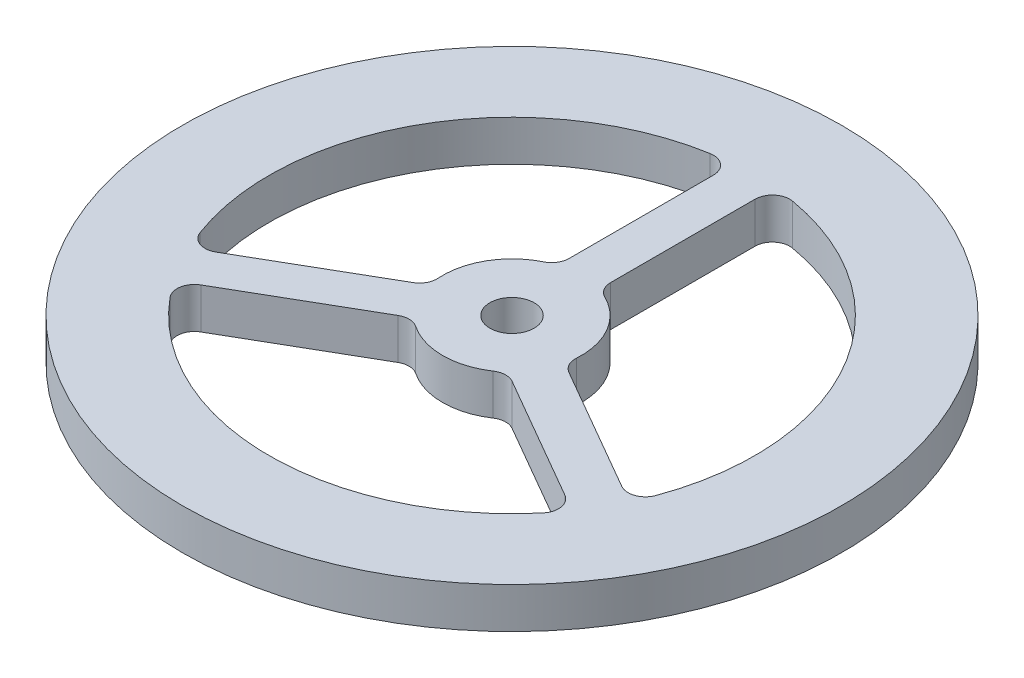
ISO-10303-21;
HEADER;
FILE_DESCRIPTION(('STEP AP214'),'2;1');
FILE_NAME('part.step','',(''),(''),'','','');
FILE_SCHEMA(('AUTOMOTIVE_DESIGN { 1 0 10303 214 1 1 1 1 }'));
ENDSEC;
DATA;
#1=APPLICATION_CONTEXT('core data for automotive mechanical design processes');
#2=APPLICATION_PROTOCOL_DEFINITION('international standard','automotive_design',2000,#1);
#3=PRODUCT_CONTEXT('',#1,'mechanical');
#4=PRODUCT('Part','Part','',(#3));
#5=PRODUCT_RELATED_PRODUCT_CATEGORY('part','',(#4));
#6=PRODUCT_DEFINITION_FORMATION('','',#4);
#7=PRODUCT_DEFINITION_CONTEXT('part definition',#1,'design');
#8=PRODUCT_DEFINITION('design','',#6,#7);
#9=PRODUCT_DEFINITION_SHAPE('','',#8);
#10=(LENGTH_UNIT() NAMED_UNIT(*) SI_UNIT(.MILLI.,.METRE.));
#11=(NAMED_UNIT(*) PLANE_ANGLE_UNIT() SI_UNIT($,.RADIAN.));
#12=(NAMED_UNIT(*) SI_UNIT($,.STERADIAN.) SOLID_ANGLE_UNIT());
#13=UNCERTAINTY_MEASURE_WITH_UNIT(LENGTH_MEASURE(1.E-05),#10,'distance_accuracy_value','');
#14=(GEOMETRIC_REPRESENTATION_CONTEXT(3) GLOBAL_UNCERTAINTY_ASSIGNED_CONTEXT((#13)) GLOBAL_UNIT_ASSIGNED_CONTEXT((#10,
#11,#12)) REPRESENTATION_CONTEXT('',''));
#15=CARTESIAN_POINT('',(0.,0.,0.));
#16=DIRECTION('',(0.,0.,1.));
#17=DIRECTION('',(1.,0.,0.));
#18=AXIS2_PLACEMENT_3D('',#15,#16,#17);
#19=CARTESIAN_POINT('',(0.,4.7,0.));
#20=DIRECTION('',(0.,1.,0.));
#21=DIRECTION('',(0.,0.,1.));
#22=AXIS2_PLACEMENT_3D('',#19,#20,#21);
#23=PLANE('',#22);
#24=CARTESIAN_POINT('',(0.,4.7,0.));
#25=DIRECTION('',(0.,1.,0.));
#26=DIRECTION('',(0.,0.,1.));
#27=AXIS2_PLACEMENT_3D('',#24,#25,#26);
#28=CIRCLE('',#27,38.);
#29=CARTESIAN_POINT('',(0.,4.7,38.));
#30=VERTEX_POINT('',#29);
#31=EDGE_CURVE('E11',#30,#30,#28,.T.);
#32=ORIENTED_EDGE('',*,*,#31,.T.);
#33=EDGE_LOOP('',(#32));
#34=FACE_BOUND('',#33,.T.);
#35=CARTESIAN_POINT('',(0.,4.7,0.));
#36=DIRECTION('',(0.,1.,0.));
#37=DIRECTION('',(0.,0.,1.));
#38=AXIS2_PLACEMENT_3D('',#35,#36,#37);
#39=CIRCLE('',#38,2.55);
#40=CARTESIAN_POINT('',(0.,4.7,2.55));
#41=VERTEX_POINT('',#40);
#42=EDGE_CURVE('E459',#41,#41,#39,.T.);
#43=ORIENTED_EDGE('',*,*,#42,.F.);
#44=EDGE_LOOP('',(#43));
#45=FACE_BOUND('',#44,.T.);
#46=CARTESIAN_POINT('',(0.,4.7,0.));
#47=DIRECTION('',(0.,1.,0.));
#48=DIRECTION('',(0.,0.,1.));
#49=AXIS2_PLACEMENT_3D('',#46,#47,#48);
#50=CIRCLE('',#49,28.);
#51=CARTESIAN_POINT('',(-4.73846153846141,4.7,-27.5961407129425));
#52=VERTEX_POINT('',#51);
#53=CARTESIAN_POINT('',(-26.268189673049,4.7,9.69444228930797));
#54=VERTEX_POINT('',#53);
#55=EDGE_CURVE('E377',#52,#54,#50,.T.);
#56=ORIENTED_EDGE('',*,*,#55,.F.);
#57=CARTESIAN_POINT('',(-4.39999999999989,4.7,-25.6249878048752));
#58=DIRECTION('',(0.,1.,0.));
#59=DIRECTION('',(0.,0.,1.));
#60=AXIS2_PLACEMENT_3D('',#57,#58,#59);
#61=CIRCLE('',#60,1.99999999999999);
#62=CARTESIAN_POINT('',(-2.3999999999999,4.7,-25.6249878048752));
#63=VERTEX_POINT('',#62);
#64=EDGE_CURVE('E376',#63,#52,#61,.T.);
#65=ORIENTED_EDGE('',*,*,#64,.F.);
#66=DIRECTION('',(0.,0.,-1.));
#67=VECTOR('',#66,1.);
#68=CARTESIAN_POINT('',(-2.3999999999999,4.7,-8.97997772825751));
#69=LINE('',#68,#67);
#70=CARTESIAN_POINT('',(-2.3999999999999,4.7,-8.97997772825751));
#71=VERTEX_POINT('',#70);
#72=EDGE_CURVE('E398',#71,#63,#69,.T.);
#73=ORIENTED_EDGE('',*,*,#72,.F.);
#74=CARTESIAN_POINT('',(-4.3999999999999,4.7,-8.97997772825751));
#75=DIRECTION('',(0.,1.,0.));
#76=DIRECTION('',(0.,0.,-1.));
#77=AXIS2_PLACEMENT_3D('',#74,#75,#76);
#78=CIRCLE('',#77,2.);
#79=CARTESIAN_POINT('',(-3.51999999999992,4.7,-7.18398218260601));
#80=VERTEX_POINT('',#79);
#81=EDGE_CURVE('E392',#80,#71,#78,.T.);
#82=ORIENTED_EDGE('',*,*,#81,.F.);
#83=CARTESIAN_POINT('',(0.,4.7,0.));
#84=DIRECTION('',(0.,-1.,0.));
#85=DIRECTION('',(0.,0.,1.));
#86=AXIS2_PLACEMENT_3D('',#83,#84,#85);
#87=CIRCLE('',#86,8.);
#88=CARTESIAN_POINT('',(-7.98151107047155,4.7,0.543581669981694));
#89=VERTEX_POINT('',#88);
#90=EDGE_CURVE('E391',#89,#80,#87,.T.);
#91=ORIENTED_EDGE('',*,*,#90,.F.);
#92=CARTESIAN_POINT('',(-9.97688883808944,4.7,0.679477087477121));
#93=DIRECTION('',(0.,1.,0.));
#94=DIRECTION('',(0.,0.,1.));
#95=AXIS2_PLACEMENT_3D('',#92,#93,#94);
#96=CIRCLE('',#95,2.);
#97=CARTESIAN_POINT('',(-8.97688883808944,4.7,2.411527895046));
#98=VERTEX_POINT('',#97);
#99=EDGE_CURVE('E386',#98,#89,#96,.T.);
#100=ORIENTED_EDGE('',*,*,#99,.F.);
#101=DIRECTION('',(0.866025403784439,0.,-0.5));
#102=VECTOR('',#101,1.);
#103=CARTESIAN_POINT('',(-8.97688883808944,4.7,2.411527895046));
#104=LINE('',#103,#102);
#105=CARTESIAN_POINT('',(-23.3918904106883,4.7,10.7340329333549));
#106=VERTEX_POINT('',#105);
#107=EDGE_CURVE('E387',#106,#98,#104,.T.);
#108=ORIENTED_EDGE('',*,*,#107,.F.);
#109=CARTESIAN_POINT('',(-24.3918904106883,4.7,9.00198212578598));
#110=DIRECTION('',(0.,1.,0.));
#111=DIRECTION('',(0.,0.,-1.));
#112=AXIS2_PLACEMENT_3D('',#109,#110,#111);
#113=CIRCLE('',#112,2.);
#114=EDGE_CURVE('E382',#54,#106,#113,.T.);
#115=ORIENTED_EDGE('',*,*,#114,.F.);
#116=EDGE_LOOP('',(#56,#65,#73,#82,#91,#100,#108,#115));
#117=FACE_BOUND('',#116,.T.);
#118=DIRECTION('',(0.,0.,1.));
#119=VECTOR('',#118,1.);
#120=CARTESIAN_POINT('',(2.4000000000001,4.7,-8.97997772825741));
#121=LINE('',#120,#119);
#122=CARTESIAN_POINT('',(2.4000000000001,4.7,-25.6249878048751));
#123=VERTEX_POINT('',#122);
#124=CARTESIAN_POINT('',(2.4000000000001,4.7,-8.97997772825741));
#125=VERTEX_POINT('',#124);
#126=EDGE_CURVE('E299',#123,#125,#121,.T.);
#127=ORIENTED_EDGE('',*,*,#126,.F.);
#128=CARTESIAN_POINT('',(4.40000000000011,4.7,-25.6249878048751));
#129=DIRECTION('',(0.,1.,0.));
#130=DIRECTION('',(0.,0.,-1.));
#131=AXIS2_PLACEMENT_3D('',#128,#129,#130);
#132=CIRCLE('',#131,2.00000000000001);
#133=CARTESIAN_POINT('',(4.73846153846165,4.7,-27.5961407129425));
#134=VERTEX_POINT('',#133);
#135=EDGE_CURVE('E291',#134,#123,#132,.T.);
#136=ORIENTED_EDGE('',*,*,#135,.F.);
#137=CARTESIAN_POINT('',(0.,4.7,0.));
#138=DIRECTION('',(0.,1.,0.));
#139=DIRECTION('',(0.,0.,1.));
#140=AXIS2_PLACEMENT_3D('',#137,#138,#139);
#141=CIRCLE('',#140,28.);
#142=CARTESIAN_POINT('',(26.2681896730491,4.7,9.69444228930775));
#143=VERTEX_POINT('',#142);
#144=EDGE_CURVE('E316',#143,#134,#141,.T.);
#145=ORIENTED_EDGE('',*,*,#144,.F.);
#146=CARTESIAN_POINT('',(24.3918904106884,4.7,9.00198212578577));
#147=DIRECTION('',(0.,1.,0.));
#148=DIRECTION('',(0.,0.,1.));
#149=AXIS2_PLACEMENT_3D('',#146,#147,#148);
#150=CIRCLE('',#149,2.);
#151=CARTESIAN_POINT('',(23.3918904106884,4.7,10.7340329333546));
#152=VERTEX_POINT('',#151);
#153=EDGE_CURVE('E315',#152,#143,#150,.T.);
#154=ORIENTED_EDGE('',*,*,#153,.F.);
#155=DIRECTION('',(0.866025403784439,0.,0.5));
#156=VECTOR('',#155,1.);
#157=CARTESIAN_POINT('',(8.97688883808945,4.7,2.41152789504575));
#158=LINE('',#157,#156);
#159=CARTESIAN_POINT('',(8.97688883808945,4.7,2.41152789504575));
#160=VERTEX_POINT('',#159);
#161=EDGE_CURVE('E310',#160,#152,#158,.T.);
#162=ORIENTED_EDGE('',*,*,#161,.F.);
#163=CARTESIAN_POINT('',(9.97688883808945,4.7,0.67947708747687));
#164=DIRECTION('',(0.,1.,0.));
#165=DIRECTION('',(0.,0.,-1.));
#166=AXIS2_PLACEMENT_3D('',#163,#164,#165);
#167=CIRCLE('',#166,2.);
#168=CARTESIAN_POINT('',(7.98151107047156,4.7,0.543581669981495));
#169=VERTEX_POINT('',#168);
#170=EDGE_CURVE('E308',#169,#160,#167,.T.);
#171=ORIENTED_EDGE('',*,*,#170,.F.);
#172=CARTESIAN_POINT('',(0.,4.7,0.));
#173=DIRECTION('',(0.,-1.,0.));
#174=DIRECTION('',(0.,0.,1.));
#175=AXIS2_PLACEMENT_3D('',#172,#173,#174);
#176=CIRCLE('',#175,8.);
#177=CARTESIAN_POINT('',(3.52000000000008,4.7,-7.18398218260593));
#178=VERTEX_POINT('',#177);
#179=EDGE_CURVE('E304',#178,#169,#176,.T.);
#180=ORIENTED_EDGE('',*,*,#179,.F.);
#181=CARTESIAN_POINT('',(4.4000000000001,4.7,-8.97997772825741));
#182=DIRECTION('',(0.,1.,0.));
#183=DIRECTION('',(0.,0.,-1.));
#184=AXIS2_PLACEMENT_3D('',#181,#182,#183);
#185=CIRCLE('',#184,2.);
#186=EDGE_CURVE('E297',#125,#178,#185,.T.);
#187=ORIENTED_EDGE('',*,*,#186,.F.);
#188=EDGE_LOOP('',(#127,#136,#145,#154,#162,#171,#180,#187));
#189=FACE_BOUND('',#188,.T.);
#190=CARTESIAN_POINT('',(0.,4.7,0.));
#191=DIRECTION('',(0.,1.,0.));
#192=DIRECTION('',(0.,0.,1.));
#193=AXIS2_PLACEMENT_3D('',#190,#191,#192);
#194=CIRCLE('',#193,28.);
#195=CARTESIAN_POINT('',(-21.5297281345875,4.7,17.9016984236344));
#196=VERTEX_POINT('',#195);
#197=CARTESIAN_POINT('',(21.5297281345876,4.7,17.9016984236342));
#198=VERTEX_POINT('',#197);
#199=EDGE_CURVE('E213',#196,#198,#194,.T.);
#200=ORIENTED_EDGE('',*,*,#199,.F.);
#201=CARTESIAN_POINT('',(-19.9918904106884,4.7,16.623005679089));
#202=DIRECTION('',(0.,1.,0.));
#203=DIRECTION('',(0.,0.,1.));
#204=AXIS2_PLACEMENT_3D('',#201,#202,#203);
#205=CIRCLE('',#204,2.);
#206=CARTESIAN_POINT('',(-20.9918904106884,4.7,14.8909548715202));
#207=VERTEX_POINT('',#206);
#208=EDGE_CURVE('E204',#207,#196,#205,.T.);
#209=ORIENTED_EDGE('',*,*,#208,.F.);
#210=DIRECTION('',(-0.866025403784439,0.,0.5));
#211=VECTOR('',#210,1.);
#212=CARTESIAN_POINT('',(-6.5768888380895,4.7,6.56844983321134));
#213=LINE('',#212,#211);
#214=CARTESIAN_POINT('',(-6.5768888380895,4.7,6.56844983321134));
#215=VERTEX_POINT('',#214);
#216=EDGE_CURVE('E242',#215,#207,#213,.T.);
#217=ORIENTED_EDGE('',*,*,#216,.F.);
#218=CARTESIAN_POINT('',(-5.5768888380895,4.7,8.30050064078021));
#219=DIRECTION('',(0.,1.,0.));
#220=DIRECTION('',(0.,0.,-1.));
#221=AXIS2_PLACEMENT_3D('',#218,#219,#220);
#222=CIRCLE('',#221,2.);
#223=CARTESIAN_POINT('',(-4.4615110704716,4.7,6.64040051262417));
#224=VERTEX_POINT('',#223);
#225=EDGE_CURVE('E241',#224,#215,#222,.T.);
#226=ORIENTED_EDGE('',*,*,#225,.F.);
#227=CARTESIAN_POINT('',(0.,4.7,0.));
#228=DIRECTION('',(0.,-1.,0.));
#229=DIRECTION('',(0.,0.,1.));
#230=AXIS2_PLACEMENT_3D('',#227,#228,#229);
#231=CIRCLE('',#230,8.);
#232=CARTESIAN_POINT('',(4.46151107047177,4.7,6.64040051262406));
#233=VERTEX_POINT('',#232);
#234=EDGE_CURVE('E239',#233,#224,#231,.T.);
#235=ORIENTED_EDGE('',*,*,#234,.F.);
#236=CARTESIAN_POINT('',(5.5768888380897,4.7,8.30050064078007));
#237=DIRECTION('',(0.,1.,0.));
#238=DIRECTION('',(0.,0.,1.));
#239=AXIS2_PLACEMENT_3D('',#236,#237,#238);
#240=CIRCLE('',#239,2.);
#241=CARTESIAN_POINT('',(6.5768888380897,4.7,6.5684498332112));
#242=VERTEX_POINT('',#241);
#243=EDGE_CURVE('E237',#242,#233,#240,.T.);
#244=ORIENTED_EDGE('',*,*,#243,.F.);
#245=DIRECTION('',(-0.866025403784439,0.,-0.5));
#246=VECTOR('',#245,1.);
#247=CARTESIAN_POINT('',(6.5768888380897,4.7,6.5684498332112));
#248=LINE('',#247,#246);
#249=CARTESIAN_POINT('',(20.9918904106885,4.7,14.89095487152));
#250=VERTEX_POINT('',#249);
#251=EDGE_CURVE('E234',#250,#242,#248,.T.);
#252=ORIENTED_EDGE('',*,*,#251,.F.);
#253=CARTESIAN_POINT('',(19.9918904106885,4.7,16.6230056790889));
#254=DIRECTION('',(0.,1.,0.));
#255=DIRECTION('',(0.,0.,-1.));
#256=AXIS2_PLACEMENT_3D('',#253,#254,#255);
#257=CIRCLE('',#256,2.);
#258=EDGE_CURVE('E226',#198,#250,#257,.T.);
#259=ORIENTED_EDGE('',*,*,#258,.F.);
#260=EDGE_LOOP('',(#200,#209,#217,#226,#235,#244,#252,#259));
#261=FACE_BOUND('',#260,.T.);
#262=ADVANCED_FACE('F45',(#34,#45,#117,#189,#261),#23,.T.);
#263=CARTESIAN_POINT('',(0.,0.,0.));
#264=DIRECTION('',(0.,1.,0.));
#265=DIRECTION('',(0.,0.,1.));
#266=AXIS2_PLACEMENT_3D('',#263,#264,#265);
#267=PLANE('',#266);
#268=CARTESIAN_POINT('',(4.40000000000011,0.,-25.6249878048751));
#269=DIRECTION('',(0.,1.,0.));
#270=DIRECTION('',(0.,0.,-1.));
#271=AXIS2_PLACEMENT_3D('',#268,#269,#270);
#272=CIRCLE('',#271,2.00000000000001);
#273=CARTESIAN_POINT('',(4.73846153846165,0.,-27.5961407129425));
#274=VERTEX_POINT('',#273);
#275=CARTESIAN_POINT('',(2.4000000000001,0.,-25.6249878048751));
#276=VERTEX_POINT('',#275);
#277=EDGE_CURVE('E225',#274,#276,#272,.T.);
#278=ORIENTED_EDGE('',*,*,#277,.T.);
#279=DIRECTION('',(0.,0.,1.));
#280=VECTOR('',#279,1.);
#281=CARTESIAN_POINT('',(2.4000000000001,0.,-8.97997772825741));
#282=LINE('',#281,#280);
#283=CARTESIAN_POINT('',(2.4000000000001,0.,-8.97997772825741));
#284=VERTEX_POINT('',#283);
#285=EDGE_CURVE('E323',#276,#284,#282,.T.);
#286=ORIENTED_EDGE('',*,*,#285,.T.);
#287=CARTESIAN_POINT('',(4.4000000000001,0.,-8.97997772825741));
#288=DIRECTION('',(0.,1.,0.));
#289=DIRECTION('',(0.,0.,-1.));
#290=AXIS2_PLACEMENT_3D('',#287,#288,#289);
#291=CIRCLE('',#290,2.);
#292=CARTESIAN_POINT('',(3.52000000000008,0.,-7.18398218260593));
#293=VERTEX_POINT('',#292);
#294=EDGE_CURVE('E330',#284,#293,#291,.T.);
#295=ORIENTED_EDGE('',*,*,#294,.T.);
#296=CARTESIAN_POINT('',(0.,0.,0.));
#297=DIRECTION('',(0.,-1.,0.));
#298=DIRECTION('',(0.,0.,1.));
#299=AXIS2_PLACEMENT_3D('',#296,#297,#298);
#300=CIRCLE('',#299,8.);
#301=CARTESIAN_POINT('',(7.98151107047156,0.,0.543581669981495));
#302=VERTEX_POINT('',#301);
#303=EDGE_CURVE('E332',#293,#302,#300,.T.);
#304=ORIENTED_EDGE('',*,*,#303,.T.);
#305=CARTESIAN_POINT('',(9.97688883808945,0.,0.67947708747687));
#306=DIRECTION('',(0.,1.,0.));
#307=DIRECTION('',(0.,0.,-1.));
#308=AXIS2_PLACEMENT_3D('',#305,#306,#307);
#309=CIRCLE('',#308,2.);
#310=CARTESIAN_POINT('',(8.97688883808945,0.,2.41152789504575));
#311=VERTEX_POINT('',#310);
#312=EDGE_CURVE('E333',#302,#311,#309,.T.);
#313=ORIENTED_EDGE('',*,*,#312,.T.);
#314=DIRECTION('',(0.866025403784439,0.,0.5));
#315=VECTOR('',#314,1.);
#316=CARTESIAN_POINT('',(8.97688883808945,0.,2.41152789504575));
#317=LINE('',#316,#315);
#318=CARTESIAN_POINT('',(23.3918904106884,0.,10.7340329333546));
#319=VERTEX_POINT('',#318);
#320=EDGE_CURVE('E338',#311,#319,#317,.T.);
#321=ORIENTED_EDGE('',*,*,#320,.T.);
#322=CARTESIAN_POINT('',(24.3918904106884,0.,9.00198212578577));
#323=DIRECTION('',(0.,1.,0.));
#324=DIRECTION('',(0.,0.,1.));
#325=AXIS2_PLACEMENT_3D('',#322,#323,#324);
#326=CIRCLE('',#325,2.);
#327=CARTESIAN_POINT('',(26.2681896730491,0.,9.69444228930775));
#328=VERTEX_POINT('',#327);
#329=EDGE_CURVE('E345',#319,#328,#326,.T.);
#330=ORIENTED_EDGE('',*,*,#329,.T.);
#331=CARTESIAN_POINT('',(0.,0.,0.));
#332=DIRECTION('',(0.,1.,0.));
#333=DIRECTION('',(0.,0.,1.));
#334=AXIS2_PLACEMENT_3D('',#331,#332,#333);
#335=CIRCLE('',#334,28.);
#336=EDGE_CURVE('E296',#328,#274,#335,.T.);
#337=ORIENTED_EDGE('',*,*,#336,.T.);
#338=EDGE_LOOP('',(#278,#286,#295,#304,#313,#321,#330,#337));
#339=FACE_BOUND('',#338,.T.);
#340=CARTESIAN_POINT('',(0.,0.,0.));
#341=DIRECTION('',(0.,1.,0.));
#342=DIRECTION('',(0.,0.,1.));
#343=AXIS2_PLACEMENT_3D('',#340,#341,#342);
#344=CIRCLE('',#343,2.55);
#345=CARTESIAN_POINT('',(0.,0.,2.55));
#346=VERTEX_POINT('',#345);
#347=EDGE_CURVE('E456',#346,#346,#344,.T.);
#348=ORIENTED_EDGE('',*,*,#347,.T.);
#349=EDGE_LOOP('',(#348));
#350=FACE_BOUND('',#349,.T.);
#351=CARTESIAN_POINT('',(0.,0.,0.));
#352=DIRECTION('',(0.,1.,0.));
#353=DIRECTION('',(0.,0.,1.));
#354=AXIS2_PLACEMENT_3D('',#351,#352,#353);
#355=CIRCLE('',#354,38.);
#356=CARTESIAN_POINT('',(0.,0.,38.));
#357=VERTEX_POINT('',#356);
#358=EDGE_CURVE('E46',#357,#357,#355,.T.);
#359=ORIENTED_EDGE('',*,*,#358,.F.);
#360=EDGE_LOOP('',(#359));
#361=FACE_BOUND('',#360,.T.);
#362=CARTESIAN_POINT('',(-4.39999999999989,0.,-25.6249878048752));
#363=DIRECTION('',(0.,1.,0.));
#364=DIRECTION('',(0.,0.,1.));
#365=AXIS2_PLACEMENT_3D('',#362,#363,#364);
#366=CIRCLE('',#365,1.99999999999999);
#367=CARTESIAN_POINT('',(-2.3999999999999,0.,-25.6249878048752));
#368=VERTEX_POINT('',#367);
#369=CARTESIAN_POINT('',(-4.73846153846141,0.,-27.5961407129425));
#370=VERTEX_POINT('',#369);
#371=EDGE_CURVE('E374',#368,#370,#366,.T.);
#372=ORIENTED_EDGE('',*,*,#371,.T.);
#373=CARTESIAN_POINT('',(0.,0.,0.));
#374=DIRECTION('',(0.,1.,0.));
#375=DIRECTION('',(0.,0.,1.));
#376=AXIS2_PLACEMENT_3D('',#373,#374,#375);
#377=CIRCLE('',#376,28.);
#378=CARTESIAN_POINT('',(-26.268189673049,0.,9.69444228930797));
#379=VERTEX_POINT('',#378);
#380=EDGE_CURVE('E409',#370,#379,#377,.T.);
#381=ORIENTED_EDGE('',*,*,#380,.T.);
#382=CARTESIAN_POINT('',(-24.3918904106883,0.,9.00198212578598));
#383=DIRECTION('',(0.,1.,0.));
#384=DIRECTION('',(0.,0.,-1.));
#385=AXIS2_PLACEMENT_3D('',#382,#383,#384);
#386=CIRCLE('',#385,2.);
#387=CARTESIAN_POINT('',(-23.3918904106883,0.,10.7340329333549));
#388=VERTEX_POINT('',#387);
#389=EDGE_CURVE('E407',#379,#388,#386,.T.);
#390=ORIENTED_EDGE('',*,*,#389,.T.);
#391=DIRECTION('',(0.866025403784439,0.,-0.5));
#392=VECTOR('',#391,1.);
#393=CARTESIAN_POINT('',(-8.97688883808944,0.,2.411527895046));
#394=LINE('',#393,#392);
#395=CARTESIAN_POINT('',(-8.97688883808944,0.,2.411527895046));
#396=VERTEX_POINT('',#395);
#397=EDGE_CURVE('E411',#388,#396,#394,.T.);
#398=ORIENTED_EDGE('',*,*,#397,.T.);
#399=CARTESIAN_POINT('',(-9.97688883808944,0.,0.679477087477121));
#400=DIRECTION('',(0.,1.,0.));
#401=DIRECTION('',(0.,0.,1.));
#402=AXIS2_PLACEMENT_3D('',#399,#400,#401);
#403=CIRCLE('',#402,2.);
#404=CARTESIAN_POINT('',(-7.98151107047155,0.,0.543581669981694));
#405=VERTEX_POINT('',#404);
#406=EDGE_CURVE('E416',#396,#405,#403,.T.);
#407=ORIENTED_EDGE('',*,*,#406,.T.);
#408=CARTESIAN_POINT('',(0.,0.,0.));
#409=DIRECTION('',(0.,-1.,0.));
#410=DIRECTION('',(0.,0.,1.));
#411=AXIS2_PLACEMENT_3D('',#408,#409,#410);
#412=CIRCLE('',#411,8.);
#413=CARTESIAN_POINT('',(-3.51999999999992,0.,-7.18398218260601));
#414=VERTEX_POINT('',#413);
#415=EDGE_CURVE('E425',#405,#414,#412,.T.);
#416=ORIENTED_EDGE('',*,*,#415,.T.);
#417=CARTESIAN_POINT('',(-4.3999999999999,0.,-8.97997772825751));
#418=DIRECTION('',(0.,1.,0.));
#419=DIRECTION('',(0.,0.,-1.));
#420=AXIS2_PLACEMENT_3D('',#417,#418,#419);
#421=CIRCLE('',#420,2.);
#422=CARTESIAN_POINT('',(-2.3999999999999,0.,-8.97997772825751));
#423=VERTEX_POINT('',#422);
#424=EDGE_CURVE('E426',#414,#423,#421,.T.);
#425=ORIENTED_EDGE('',*,*,#424,.T.);
#426=DIRECTION('',(0.,0.,-1.));
#427=VECTOR('',#426,1.);
#428=CARTESIAN_POINT('',(-2.3999999999999,0.,-8.97997772825751));
#429=LINE('',#428,#427);
#430=EDGE_CURVE('E379',#423,#368,#429,.T.);
#431=ORIENTED_EDGE('',*,*,#430,.T.);
#432=EDGE_LOOP('',(#372,#381,#390,#398,#407,#416,#425,#431));
#433=FACE_BOUND('',#432,.T.);
#434=CARTESIAN_POINT('',(-19.9918904106884,0.,16.623005679089));
#435=DIRECTION('',(0.,1.,0.));
#436=DIRECTION('',(0.,0.,1.));
#437=AXIS2_PLACEMENT_3D('',#434,#435,#436);
#438=CIRCLE('',#437,2.);
#439=CARTESIAN_POINT('',(-20.9918904106884,0.,14.8909548715202));
#440=VERTEX_POINT('',#439);
#441=CARTESIAN_POINT('',(-21.5297281345875,0.,17.9016984236344));
#442=VERTEX_POINT('',#441);
#443=EDGE_CURVE('E69',#440,#442,#438,.T.);
#444=ORIENTED_EDGE('',*,*,#443,.T.);
#445=CARTESIAN_POINT('',(0.,0.,0.));
#446=DIRECTION('',(0.,1.,0.));
#447=DIRECTION('',(0.,0.,1.));
#448=AXIS2_PLACEMENT_3D('',#445,#446,#447);
#449=CIRCLE('',#448,28.);
#450=CARTESIAN_POINT('',(21.5297281345876,0.,17.9016984236342));
#451=VERTEX_POINT('',#450);
#452=EDGE_CURVE('E219',#442,#451,#449,.T.);
#453=ORIENTED_EDGE('',*,*,#452,.T.);
#454=CARTESIAN_POINT('',(19.9918904106885,0.,16.6230056790889));
#455=DIRECTION('',(0.,1.,0.));
#456=DIRECTION('',(0.,0.,-1.));
#457=AXIS2_PLACEMENT_3D('',#454,#455,#456);
#458=CIRCLE('',#457,2.);
#459=CARTESIAN_POINT('',(20.9918904106885,0.,14.89095487152));
#460=VERTEX_POINT('',#459);
#461=EDGE_CURVE('E252',#451,#460,#458,.T.);
#462=ORIENTED_EDGE('',*,*,#461,.T.);
#463=DIRECTION('',(-0.866025403784439,0.,-0.5));
#464=VECTOR('',#463,1.);
#465=CARTESIAN_POINT('',(6.5768888380897,0.,6.5684498332112));
#466=LINE('',#465,#464);
#467=CARTESIAN_POINT('',(6.5768888380897,0.,6.5684498332112));
#468=VERTEX_POINT('',#467);
#469=EDGE_CURVE('E258',#460,#468,#466,.T.);
#470=ORIENTED_EDGE('',*,*,#469,.T.);
#471=CARTESIAN_POINT('',(5.5768888380897,0.,8.30050064078007));
#472=DIRECTION('',(0.,1.,0.));
#473=DIRECTION('',(0.,0.,1.));
#474=AXIS2_PLACEMENT_3D('',#471,#472,#473);
#475=CIRCLE('',#474,2.);
#476=CARTESIAN_POINT('',(4.46151107047177,0.,6.64040051262406));
#477=VERTEX_POINT('',#476);
#478=EDGE_CURVE('E257',#468,#477,#475,.T.);
#479=ORIENTED_EDGE('',*,*,#478,.T.);
#480=CARTESIAN_POINT('',(0.,0.,0.));
#481=DIRECTION('',(0.,-1.,0.));
#482=DIRECTION('',(0.,0.,1.));
#483=AXIS2_PLACEMENT_3D('',#480,#481,#482);
#484=CIRCLE('',#483,8.);
#485=CARTESIAN_POINT('',(-4.4615110704716,0.,6.64040051262417));
#486=VERTEX_POINT('',#485);
#487=EDGE_CURVE('E262',#477,#486,#484,.T.);
#488=ORIENTED_EDGE('',*,*,#487,.T.);
#489=CARTESIAN_POINT('',(-5.5768888380895,0.,8.30050064078021));
#490=DIRECTION('',(0.,1.,0.));
#491=DIRECTION('',(0.,0.,-1.));
#492=AXIS2_PLACEMENT_3D('',#489,#490,#491);
#493=CIRCLE('',#492,2.);
#494=CARTESIAN_POINT('',(-6.5768888380895,0.,6.56844983321134));
#495=VERTEX_POINT('',#494);
#496=EDGE_CURVE('E268',#486,#495,#493,.T.);
#497=ORIENTED_EDGE('',*,*,#496,.T.);
#498=DIRECTION('',(-0.866025403784439,0.,0.5));
#499=VECTOR('',#498,1.);
#500=CARTESIAN_POINT('',(-6.5768888380895,0.,6.56844983321134));
#501=LINE('',#500,#499);
#502=EDGE_CURVE('E212',#495,#440,#501,.T.);
#503=ORIENTED_EDGE('',*,*,#502,.T.);
#504=EDGE_LOOP('',(#444,#453,#462,#470,#479,#488,#497,#503));
#505=FACE_BOUND('',#504,.T.);
#506=ADVANCED_FACE('F470',(#339,#350,#361,#433,#505),#267,.F.);
#507=CARTESIAN_POINT('',(0.,4.7,0.));
#508=DIRECTION('',(0.,-1.,0.));
#509=DIRECTION('',(0.,0.,-1.));
#510=AXIS2_PLACEMENT_3D('',#507,#508,#509);
#511=CYLINDRICAL_SURFACE('',#510,38.);
#512=ORIENTED_EDGE('',*,*,#31,.F.);
#513=EDGE_LOOP('',(#512));
#514=FACE_BOUND('',#513,.T.);
#515=ORIENTED_EDGE('',*,*,#358,.T.);
#516=EDGE_LOOP('',(#515));
#517=FACE_BOUND('',#516,.T.);
#518=ADVANCED_FACE('F42',(#514,#517),#511,.T.);
#519=CARTESIAN_POINT('',(0.,4.7,0.));
#520=DIRECTION('',(0.,-1.,0.));
#521=DIRECTION('',(0.,0.,-1.));
#522=AXIS2_PLACEMENT_3D('',#519,#520,#521);
#523=CYLINDRICAL_SURFACE('',#522,2.55);
#524=ORIENTED_EDGE('',*,*,#42,.T.);
#525=EDGE_LOOP('',(#524));
#526=FACE_BOUND('',#525,.T.);
#527=ORIENTED_EDGE('',*,*,#347,.F.);
#528=EDGE_LOOP('',(#527));
#529=FACE_BOUND('',#528,.T.);
#530=ADVANCED_FACE('F468',(#526,#529),#523,.F.);
#531=CARTESIAN_POINT('',(-4.39999999999989,4.7,-25.6249878048752));
#532=DIRECTION('',(0.,-1.,0.));
#533=DIRECTION('',(0.,0.,-1.));
#534=AXIS2_PLACEMENT_3D('',#531,#532,#533);
#535=CYLINDRICAL_SURFACE('',#534,1.99999999999999);
#536=ORIENTED_EDGE('',*,*,#371,.F.);
#537=DIRECTION('',(0.,-1.,0.));
#538=VECTOR('',#537,1.);
#539=CARTESIAN_POINT('',(-2.3999999999999,4.7,-25.6249878048752));
#540=LINE('',#539,#538);
#541=EDGE_CURVE('E405',#63,#368,#540,.T.);
#542=ORIENTED_EDGE('',*,*,#541,.F.);
#543=ORIENTED_EDGE('',*,*,#64,.T.);
#544=DIRECTION('',(0.,-1.,0.));
#545=VECTOR('',#544,1.);
#546=CARTESIAN_POINT('',(-4.73846153846141,4.7,-27.5961407129425));
#547=LINE('',#546,#545);
#548=EDGE_CURVE('E453',#52,#370,#547,.T.);
#549=ORIENTED_EDGE('',*,*,#548,.T.);
#550=EDGE_LOOP('',(#536,#542,#543,#549));
#551=FACE_BOUND('',#550,.T.);
#552=ADVANCED_FACE('F472',(#551),#535,.F.);
#553=CARTESIAN_POINT('',(0.,4.7,0.));
#554=DIRECTION('',(0.,-1.,0.));
#555=DIRECTION('',(0.,0.,-1.));
#556=AXIS2_PLACEMENT_3D('',#553,#554,#555);
#557=CYLINDRICAL_SURFACE('',#556,28.);
#558=ORIENTED_EDGE('',*,*,#380,.F.);
#559=ORIENTED_EDGE('',*,*,#548,.F.);
#560=ORIENTED_EDGE('',*,*,#55,.T.);
#561=DIRECTION('',(0.,-1.,0.));
#562=VECTOR('',#561,1.);
#563=CARTESIAN_POINT('',(-26.268189673049,4.7,9.69444228930797));
#564=LINE('',#563,#562);
#565=EDGE_CURVE('E454',#54,#379,#564,.T.);
#566=ORIENTED_EDGE('',*,*,#565,.T.);
#567=EDGE_LOOP('',(#558,#559,#560,#566));
#568=FACE_BOUND('',#567,.T.);
#569=ADVANCED_FACE('F479',(#568),#557,.F.);
#570=CARTESIAN_POINT('',(-24.3918904106883,4.7,9.00198212578598));
#571=DIRECTION('',(0.,-1.,0.));
#572=DIRECTION('',(0.,0.,-1.));
#573=AXIS2_PLACEMENT_3D('',#570,#571,#572);
#574=CYLINDRICAL_SURFACE('',#573,2.);
#575=ORIENTED_EDGE('',*,*,#389,.F.);
#576=ORIENTED_EDGE('',*,*,#565,.F.);
#577=ORIENTED_EDGE('',*,*,#114,.T.);
#578=DIRECTION('',(0.,-1.,0.));
#579=VECTOR('',#578,1.);
#580=CARTESIAN_POINT('',(-23.3918904106883,4.7,10.7340329333549));
#581=LINE('',#580,#579);
#582=EDGE_CURVE('E450',#106,#388,#581,.T.);
#583=ORIENTED_EDGE('',*,*,#582,.T.);
#584=EDGE_LOOP('',(#575,#576,#577,#583));
#585=FACE_BOUND('',#584,.T.);
#586=ADVANCED_FACE('F566',(#585),#574,.F.);
#587=CARTESIAN_POINT('',(-8.97688883808944,4.7,2.411527895046));
#588=DIRECTION('',(-0.5,0.,-0.866025403784439));
#589=DIRECTION('',(-0.866025403784439,0.,0.5));
#590=AXIS2_PLACEMENT_3D('',#587,#588,#589);
#591=PLANE('',#590);
#592=ORIENTED_EDGE('',*,*,#397,.F.);
#593=ORIENTED_EDGE('',*,*,#582,.F.);
#594=ORIENTED_EDGE('',*,*,#107,.T.);
#595=DIRECTION('',(0.,-1.,0.));
#596=VECTOR('',#595,1.);
#597=CARTESIAN_POINT('',(-8.97688883808944,4.7,2.411527895046));
#598=LINE('',#597,#596);
#599=EDGE_CURVE('E443',#98,#396,#598,.T.);
#600=ORIENTED_EDGE('',*,*,#599,.T.);
#601=EDGE_LOOP('',(#592,#593,#594,#600));
#602=FACE_BOUND('',#601,.T.);
#603=ADVANCED_FACE('F563',(#602),#591,.T.);
#604=CARTESIAN_POINT('',(-9.97688883808944,4.7,0.679477087477121));
#605=DIRECTION('',(0.,-1.,0.));
#606=DIRECTION('',(0.,0.,-1.));
#607=AXIS2_PLACEMENT_3D('',#604,#605,#606);
#608=CYLINDRICAL_SURFACE('',#607,2.);
#609=ORIENTED_EDGE('',*,*,#406,.F.);
#610=ORIENTED_EDGE('',*,*,#599,.F.);
#611=ORIENTED_EDGE('',*,*,#99,.T.);
#612=DIRECTION('',(0.,-1.,0.));
#613=VECTOR('',#612,1.);
#614=CARTESIAN_POINT('',(-7.98151107047155,4.7,0.543581669981694));
#615=LINE('',#614,#613);
#616=EDGE_CURVE('E445',#89,#405,#615,.T.);
#617=ORIENTED_EDGE('',*,*,#616,.T.);
#618=EDGE_LOOP('',(#609,#610,#611,#617));
#619=FACE_BOUND('',#618,.T.);
#620=ADVANCED_FACE('F557',(#619),#608,.F.);
#621=CARTESIAN_POINT('',(0.,4.7,0.));
#622=DIRECTION('',(0.,-1.,0.));
#623=DIRECTION('',(0.,0.,-1.));
#624=AXIS2_PLACEMENT_3D('',#621,#622,#623);
#625=CYLINDRICAL_SURFACE('',#624,8.);
#626=ORIENTED_EDGE('',*,*,#415,.F.);
#627=ORIENTED_EDGE('',*,*,#616,.F.);
#628=ORIENTED_EDGE('',*,*,#90,.T.);
#629=DIRECTION('',(0.,-1.,0.));
#630=VECTOR('',#629,1.);
#631=CARTESIAN_POINT('',(-3.51999999999992,4.7,-7.18398218260601));
#632=LINE('',#631,#630);
#633=EDGE_CURVE('E438',#80,#414,#632,.T.);
#634=ORIENTED_EDGE('',*,*,#633,.T.);
#635=EDGE_LOOP('',(#626,#627,#628,#634));
#636=FACE_BOUND('',#635,.T.);
#637=ADVANCED_FACE('F559',(#636),#625,.T.);
#638=CARTESIAN_POINT('',(-4.3999999999999,4.7,-8.97997772825751));
#639=DIRECTION('',(0.,-1.,0.));
#640=DIRECTION('',(0.,0.,-1.));
#641=AXIS2_PLACEMENT_3D('',#638,#639,#640);
#642=CYLINDRICAL_SURFACE('',#641,2.);
#643=ORIENTED_EDGE('',*,*,#424,.F.);
#644=ORIENTED_EDGE('',*,*,#633,.F.);
#645=ORIENTED_EDGE('',*,*,#81,.T.);
#646=DIRECTION('',(0.,-1.,0.));
#647=VECTOR('',#646,1.);
#648=CARTESIAN_POINT('',(-2.3999999999999,4.7,-8.97997772825751));
#649=LINE('',#648,#647);
#650=EDGE_CURVE('E436',#71,#423,#649,.T.);
#651=ORIENTED_EDGE('',*,*,#650,.T.);
#652=EDGE_LOOP('',(#643,#644,#645,#651));
#653=FACE_BOUND('',#652,.T.);
#654=ADVANCED_FACE('F555',(#653),#642,.F.);
#655=CARTESIAN_POINT('',(-2.3999999999999,4.7,-8.97997772825751));
#656=DIRECTION('',(-1.,0.,0.));
#657=DIRECTION('',(0.,0.,1.));
#658=AXIS2_PLACEMENT_3D('',#655,#656,#657);
#659=PLANE('',#658);
#660=ORIENTED_EDGE('',*,*,#430,.F.);
#661=ORIENTED_EDGE('',*,*,#650,.F.);
#662=ORIENTED_EDGE('',*,*,#72,.T.);
#663=ORIENTED_EDGE('',*,*,#541,.T.);
#664=EDGE_LOOP('',(#660,#661,#662,#663));
#665=FACE_BOUND('',#664,.T.);
#666=ADVANCED_FACE('F548',(#665),#659,.T.);
#667=CARTESIAN_POINT('',(4.40000000000011,4.7,-25.6249878048751));
#668=DIRECTION('',(0.,-1.,0.));
#669=DIRECTION('',(0.,0.,-1.));
#670=AXIS2_PLACEMENT_3D('',#667,#668,#669);
#671=CYLINDRICAL_SURFACE('',#670,2.00000000000001);
#672=ORIENTED_EDGE('',*,*,#277,.F.);
#673=DIRECTION('',(0.,-1.,0.));
#674=VECTOR('',#673,1.);
#675=CARTESIAN_POINT('',(4.73846153846165,4.7,-27.5961407129425));
#676=LINE('',#675,#674);
#677=EDGE_CURVE('E317',#134,#274,#676,.T.);
#678=ORIENTED_EDGE('',*,*,#677,.F.);
#679=ORIENTED_EDGE('',*,*,#135,.T.);
#680=DIRECTION('',(0.,-1.,0.));
#681=VECTOR('',#680,1.);
#682=CARTESIAN_POINT('',(2.4000000000001,4.7,-25.6249878048751));
#683=LINE('',#682,#681);
#684=EDGE_CURVE('E371',#123,#276,#683,.T.);
#685=ORIENTED_EDGE('',*,*,#684,.T.);
#686=EDGE_LOOP('',(#672,#678,#679,#685));
#687=FACE_BOUND('',#686,.T.);
#688=ADVANCED_FACE('F511',(#687),#671,.F.);
#689=CARTESIAN_POINT('',(2.4000000000001,4.7,-8.97997772825741));
#690=DIRECTION('',(1.,0.,0.));
#691=DIRECTION('',(0.,0.,-1.));
#692=AXIS2_PLACEMENT_3D('',#689,#690,#691);
#693=PLANE('',#692);
#694=ORIENTED_EDGE('',*,*,#285,.F.);
#695=ORIENTED_EDGE('',*,*,#684,.F.);
#696=ORIENTED_EDGE('',*,*,#126,.T.);
#697=DIRECTION('',(0.,-1.,0.));
#698=VECTOR('',#697,1.);
#699=CARTESIAN_POINT('',(2.4000000000001,4.7,-8.97997772825741));
#700=LINE('',#699,#698);
#701=EDGE_CURVE('E366',#125,#284,#700,.T.);
#702=ORIENTED_EDGE('',*,*,#701,.T.);
#703=EDGE_LOOP('',(#694,#695,#696,#702));
#704=FACE_BOUND('',#703,.T.);
#705=ADVANCED_FACE('F509',(#704),#693,.T.);
#706=CARTESIAN_POINT('',(4.4000000000001,4.7,-8.97997772825741));
#707=DIRECTION('',(0.,-1.,0.));
#708=DIRECTION('',(0.,0.,-1.));
#709=AXIS2_PLACEMENT_3D('',#706,#707,#708);
#710=CYLINDRICAL_SURFACE('',#709,2.);
#711=ORIENTED_EDGE('',*,*,#294,.F.);
#712=ORIENTED_EDGE('',*,*,#701,.F.);
#713=ORIENTED_EDGE('',*,*,#186,.T.);
#714=DIRECTION('',(0.,-1.,0.));
#715=VECTOR('',#714,1.);
#716=CARTESIAN_POINT('',(3.52000000000008,4.7,-7.18398218260593));
#717=LINE('',#716,#715);
#718=EDGE_CURVE('E364',#178,#293,#717,.T.);
#719=ORIENTED_EDGE('',*,*,#718,.T.);
#720=EDGE_LOOP('',(#711,#712,#713,#719));
#721=FACE_BOUND('',#720,.T.);
#722=ADVANCED_FACE('F508',(#721),#710,.F.);
#723=CARTESIAN_POINT('',(0.,4.7,0.));
#724=DIRECTION('',(0.,-1.,0.));
#725=DIRECTION('',(0.,0.,-1.));
#726=AXIS2_PLACEMENT_3D('',#723,#724,#725);
#727=CYLINDRICAL_SURFACE('',#726,8.);
#728=ORIENTED_EDGE('',*,*,#303,.F.);
#729=ORIENTED_EDGE('',*,*,#718,.F.);
#730=ORIENTED_EDGE('',*,*,#179,.T.);
#731=DIRECTION('',(0.,-1.,0.));
#732=VECTOR('',#731,1.);
#733=CARTESIAN_POINT('',(7.98151107047156,4.7,0.543581669981495));
#734=LINE('',#733,#732);
#735=EDGE_CURVE('E362',#169,#302,#734,.T.);
#736=ORIENTED_EDGE('',*,*,#735,.T.);
#737=EDGE_LOOP('',(#728,#729,#730,#736));
#738=FACE_BOUND('',#737,.T.);
#739=ADVANCED_FACE('F534',(#738),#727,.T.);
#740=CARTESIAN_POINT('',(9.97688883808945,4.7,0.67947708747687));
#741=DIRECTION('',(0.,-1.,0.));
#742=DIRECTION('',(0.,0.,-1.));
#743=AXIS2_PLACEMENT_3D('',#740,#741,#742);
#744=CYLINDRICAL_SURFACE('',#743,2.);
#745=ORIENTED_EDGE('',*,*,#312,.F.);
#746=ORIENTED_EDGE('',*,*,#735,.F.);
#747=ORIENTED_EDGE('',*,*,#170,.T.);
#748=DIRECTION('',(0.,-1.,0.));
#749=VECTOR('',#748,1.);
#750=CARTESIAN_POINT('',(8.97688883808945,4.7,2.41152789504575));
#751=LINE('',#750,#749);
#752=EDGE_CURVE('E356',#160,#311,#751,.T.);
#753=ORIENTED_EDGE('',*,*,#752,.T.);
#754=EDGE_LOOP('',(#745,#746,#747,#753));
#755=FACE_BOUND('',#754,.T.);
#756=ADVANCED_FACE('F533',(#755),#744,.F.);
#757=CARTESIAN_POINT('',(8.97688883808945,4.7,2.41152789504575));
#758=DIRECTION('',(0.5,0.,-0.866025403784439));
#759=DIRECTION('',(-0.866025403784439,0.,-0.5));
#760=AXIS2_PLACEMENT_3D('',#757,#758,#759);
#761=PLANE('',#760);
#762=ORIENTED_EDGE('',*,*,#320,.F.);
#763=ORIENTED_EDGE('',*,*,#752,.F.);
#764=ORIENTED_EDGE('',*,*,#161,.T.);
#765=DIRECTION('',(0.,-1.,0.));
#766=VECTOR('',#765,1.);
#767=CARTESIAN_POINT('',(23.3918904106884,4.7,10.7340329333546));
#768=LINE('',#767,#766);
#769=EDGE_CURVE('E357',#152,#319,#768,.T.);
#770=ORIENTED_EDGE('',*,*,#769,.T.);
#771=EDGE_LOOP('',(#762,#763,#764,#770));
#772=FACE_BOUND('',#771,.T.);
#773=ADVANCED_FACE('F526',(#772),#761,.T.);
#774=CARTESIAN_POINT('',(24.3918904106884,4.7,9.00198212578577));
#775=DIRECTION('',(0.,-1.,0.));
#776=DIRECTION('',(0.,0.,-1.));
#777=AXIS2_PLACEMENT_3D('',#774,#775,#776);
#778=CYLINDRICAL_SURFACE('',#777,2.);
#779=ORIENTED_EDGE('',*,*,#329,.F.);
#780=ORIENTED_EDGE('',*,*,#769,.F.);
#781=ORIENTED_EDGE('',*,*,#153,.T.);
#782=DIRECTION('',(0.,-1.,0.));
#783=VECTOR('',#782,1.);
#784=CARTESIAN_POINT('',(26.2681896730491,4.7,9.69444228930775));
#785=LINE('',#784,#783);
#786=EDGE_CURVE('E355',#143,#328,#785,.T.);
#787=ORIENTED_EDGE('',*,*,#786,.T.);
#788=EDGE_LOOP('',(#779,#780,#781,#787));
#789=FACE_BOUND('',#788,.T.);
#790=ADVANCED_FACE('F525',(#789),#778,.F.);
#791=CARTESIAN_POINT('',(0.,4.7,0.));
#792=DIRECTION('',(0.,-1.,0.));
#793=DIRECTION('',(0.,0.,-1.));
#794=AXIS2_PLACEMENT_3D('',#791,#792,#793);
#795=CYLINDRICAL_SURFACE('',#794,28.);
#796=ORIENTED_EDGE('',*,*,#336,.F.);
#797=ORIENTED_EDGE('',*,*,#786,.F.);
#798=ORIENTED_EDGE('',*,*,#144,.T.);
#799=ORIENTED_EDGE('',*,*,#677,.T.);
#800=EDGE_LOOP('',(#796,#797,#798,#799));
#801=FACE_BOUND('',#800,.T.);
#802=ADVANCED_FACE('F516',(#801),#795,.F.);
#803=CARTESIAN_POINT('',(-19.9918904106884,4.7,16.623005679089));
#804=DIRECTION('',(0.,-1.,0.));
#805=DIRECTION('',(0.,0.,-1.));
#806=AXIS2_PLACEMENT_3D('',#803,#804,#805);
#807=CYLINDRICAL_SURFACE('',#806,2.);
#808=ORIENTED_EDGE('',*,*,#443,.F.);
#809=DIRECTION('',(0.,-1.,0.));
#810=VECTOR('',#809,1.);
#811=CARTESIAN_POINT('',(-20.9918904106884,4.7,14.8909548715202));
#812=LINE('',#811,#810);
#813=EDGE_CURVE('E208',#207,#440,#812,.T.);
#814=ORIENTED_EDGE('',*,*,#813,.F.);
#815=ORIENTED_EDGE('',*,*,#208,.T.);
#816=DIRECTION('',(0.,-1.,0.));
#817=VECTOR('',#816,1.);
#818=CARTESIAN_POINT('',(-21.5297281345875,4.7,17.9016984236344));
#819=LINE('',#818,#817);
#820=EDGE_CURVE('E210',#196,#442,#819,.T.);
#821=ORIENTED_EDGE('',*,*,#820,.T.);
#822=EDGE_LOOP('',(#808,#814,#815,#821));
#823=FACE_BOUND('',#822,.T.);
#824=ADVANCED_FACE('F206',(#823),#807,.F.);
#825=CARTESIAN_POINT('',(0.,4.7,0.));
#826=DIRECTION('',(0.,-1.,0.));
#827=DIRECTION('',(0.,0.,-1.));
#828=AXIS2_PLACEMENT_3D('',#825,#826,#827);
#829=CYLINDRICAL_SURFACE('',#828,28.);
#830=ORIENTED_EDGE('',*,*,#452,.F.);
#831=ORIENTED_EDGE('',*,*,#820,.F.);
#832=ORIENTED_EDGE('',*,*,#199,.T.);
#833=DIRECTION('',(0.,-1.,0.));
#834=VECTOR('',#833,1.);
#835=CARTESIAN_POINT('',(21.5297281345876,4.7,17.9016984236342));
#836=LINE('',#835,#834);
#837=EDGE_CURVE('E224',#198,#451,#836,.T.);
#838=ORIENTED_EDGE('',*,*,#837,.T.);
#839=EDGE_LOOP('',(#830,#831,#832,#838));
#840=FACE_BOUND('',#839,.T.);
#841=ADVANCED_FACE('F220',(#840),#829,.F.);
#842=CARTESIAN_POINT('',(19.9918904106885,4.7,16.6230056790889));
#843=DIRECTION('',(0.,-1.,0.));
#844=DIRECTION('',(0.,0.,-1.));
#845=AXIS2_PLACEMENT_3D('',#842,#843,#844);
#846=CYLINDRICAL_SURFACE('',#845,2.);
#847=ORIENTED_EDGE('',*,*,#461,.F.);
#848=ORIENTED_EDGE('',*,*,#837,.F.);
#849=ORIENTED_EDGE('',*,*,#258,.T.);
#850=DIRECTION('',(0.,-1.,0.));
#851=VECTOR('',#850,1.);
#852=CARTESIAN_POINT('',(20.9918904106885,4.7,14.89095487152));
#853=LINE('',#852,#851);
#854=EDGE_CURVE('E290',#250,#460,#853,.T.);
#855=ORIENTED_EDGE('',*,*,#854,.T.);
#856=EDGE_LOOP('',(#847,#848,#849,#855));
#857=FACE_BOUND('',#856,.T.);
#858=ADVANCED_FACE('F618',(#857),#846,.F.);
#859=CARTESIAN_POINT('',(6.5768888380897,4.7,6.5684498332112));
#860=DIRECTION('',(-0.5,0.,0.866025403784439));
#861=DIRECTION('',(0.866025403784439,0.,0.5));
#862=AXIS2_PLACEMENT_3D('',#859,#860,#861);
#863=PLANE('',#862);
#864=ORIENTED_EDGE('',*,*,#469,.F.);
#865=ORIENTED_EDGE('',*,*,#854,.F.);
#866=ORIENTED_EDGE('',*,*,#251,.T.);
#867=DIRECTION('',(0.,-1.,0.));
#868=VECTOR('',#867,1.);
#869=CARTESIAN_POINT('',(6.5768888380897,4.7,6.5684498332112));
#870=LINE('',#869,#868);
#871=EDGE_CURVE('E282',#242,#468,#870,.T.);
#872=ORIENTED_EDGE('',*,*,#871,.T.);
#873=EDGE_LOOP('',(#864,#865,#866,#872));
#874=FACE_BOUND('',#873,.T.);
#875=ADVANCED_FACE('F619',(#874),#863,.T.);
#876=CARTESIAN_POINT('',(5.5768888380897,4.7,8.30050064078007));
#877=DIRECTION('',(0.,-1.,0.));
#878=DIRECTION('',(0.,0.,-1.));
#879=AXIS2_PLACEMENT_3D('',#876,#877,#878);
#880=CYLINDRICAL_SURFACE('',#879,2.);
#881=ORIENTED_EDGE('',*,*,#478,.F.);
#882=ORIENTED_EDGE('',*,*,#871,.F.);
#883=ORIENTED_EDGE('',*,*,#243,.T.);
#884=DIRECTION('',(0.,-1.,0.));
#885=VECTOR('',#884,1.);
#886=CARTESIAN_POINT('',(4.46151107047177,4.7,6.64040051262406));
#887=LINE('',#886,#885);
#888=EDGE_CURVE('E281',#233,#477,#887,.T.);
#889=ORIENTED_EDGE('',*,*,#888,.T.);
#890=EDGE_LOOP('',(#881,#882,#883,#889));
#891=FACE_BOUND('',#890,.T.);
#892=ADVANCED_FACE('F614',(#891),#880,.F.);
#893=CARTESIAN_POINT('',(0.,4.7,0.));
#894=DIRECTION('',(0.,-1.,0.));
#895=DIRECTION('',(0.,0.,-1.));
#896=AXIS2_PLACEMENT_3D('',#893,#894,#895);
#897=CYLINDRICAL_SURFACE('',#896,8.);
#898=ORIENTED_EDGE('',*,*,#487,.F.);
#899=ORIENTED_EDGE('',*,*,#888,.F.);
#900=ORIENTED_EDGE('',*,*,#234,.T.);
#901=DIRECTION('',(0.,-1.,0.));
#902=VECTOR('',#901,1.);
#903=CARTESIAN_POINT('',(-4.4615110704716,4.7,6.64040051262417));
#904=LINE('',#903,#902);
#905=EDGE_CURVE('E276',#224,#486,#904,.T.);
#906=ORIENTED_EDGE('',*,*,#905,.T.);
#907=EDGE_LOOP('',(#898,#899,#900,#906));
#908=FACE_BOUND('',#907,.T.);
#909=ADVANCED_FACE('F610',(#908),#897,.T.);
#910=CARTESIAN_POINT('',(-5.5768888380895,4.7,8.30050064078021));
#911=DIRECTION('',(0.,-1.,0.));
#912=DIRECTION('',(0.,0.,-1.));
#913=AXIS2_PLACEMENT_3D('',#910,#911,#912);
#914=CYLINDRICAL_SURFACE('',#913,2.);
#915=ORIENTED_EDGE('',*,*,#496,.F.);
#916=ORIENTED_EDGE('',*,*,#905,.F.);
#917=ORIENTED_EDGE('',*,*,#225,.T.);
#918=DIRECTION('',(0.,-1.,0.));
#919=VECTOR('',#918,1.);
#920=CARTESIAN_POINT('',(-6.5768888380895,4.7,6.56844983321134));
#921=LINE('',#920,#919);
#922=EDGE_CURVE('E59',#215,#495,#921,.T.);
#923=ORIENTED_EDGE('',*,*,#922,.T.);
#924=EDGE_LOOP('',(#915,#916,#917,#923));
#925=FACE_BOUND('',#924,.T.);
#926=ADVANCED_FACE('F603',(#925),#914,.F.);
#927=CARTESIAN_POINT('',(-6.5768888380895,4.7,6.56844983321134));
#928=DIRECTION('',(0.5,0.,0.866025403784439));
#929=DIRECTION('',(0.866025403784439,0.,-0.5));
#930=AXIS2_PLACEMENT_3D('',#927,#928,#929);
#931=PLANE('',#930);
#932=ORIENTED_EDGE('',*,*,#502,.F.);
#933=ORIENTED_EDGE('',*,*,#922,.F.);
#934=ORIENTED_EDGE('',*,*,#216,.T.);
#935=ORIENTED_EDGE('',*,*,#813,.T.);
#936=EDGE_LOOP('',(#932,#933,#934,#935));
#937=FACE_BOUND('',#936,.T.);
#938=ADVANCED_FACE('F598',(#937),#931,.T.);
#939=CLOSED_SHELL('',(#262,#506,#518,#530,#552,#569,#586,#603,#620,#637,#654,#666,#688,#705,
#722,#739,#756,#773,#790,#802,#824,#841,#858,#875,#892,#909,#926,#938));
#940=MANIFOLD_SOLID_BREP('B2',#939);
#941=ADVANCED_BREP_SHAPE_REPRESENTATION('',(#18,#940),#14);
#942=SHAPE_DEFINITION_REPRESENTATION(#9,#941);
ENDSEC;
END-ISO-10303-21;
